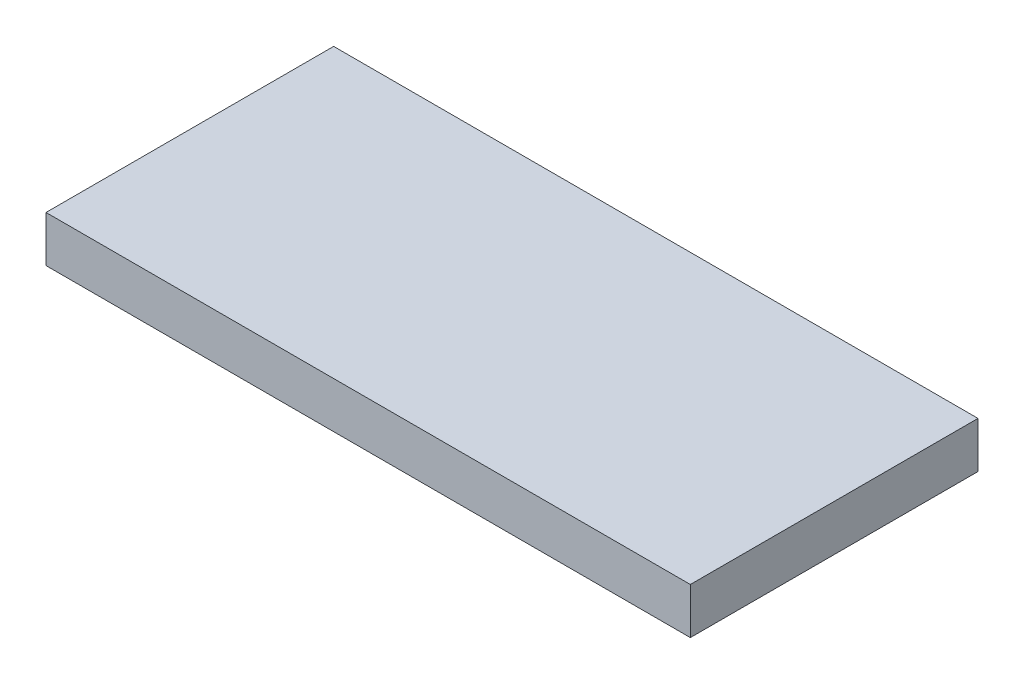
ISO-10303-21;
HEADER;
FILE_DESCRIPTION(('STEP AP214'),'2;1');
FILE_NAME('part.step','',(''),(''),'','','');
FILE_SCHEMA(('AUTOMOTIVE_DESIGN { 1 0 10303 214 1 1 1 1 }'));
ENDSEC;
DATA;
#1=APPLICATION_CONTEXT('core data for automotive mechanical design processes');
#2=APPLICATION_PROTOCOL_DEFINITION('international standard','automotive_design',2000,#1);
#3=PRODUCT_CONTEXT('',#1,'mechanical');
#4=PRODUCT('Part','Part','',(#3));
#5=PRODUCT_RELATED_PRODUCT_CATEGORY('part','',(#4));
#6=PRODUCT_DEFINITION_FORMATION('','',#4);
#7=PRODUCT_DEFINITION_CONTEXT('part definition',#1,'design');
#8=PRODUCT_DEFINITION('design','',#6,#7);
#9=PRODUCT_DEFINITION_SHAPE('','',#8);
#10=(LENGTH_UNIT() NAMED_UNIT(*) SI_UNIT(.MILLI.,.METRE.));
#11=(NAMED_UNIT(*) PLANE_ANGLE_UNIT() SI_UNIT($,.RADIAN.));
#12=(NAMED_UNIT(*) SI_UNIT($,.STERADIAN.) SOLID_ANGLE_UNIT());
#13=UNCERTAINTY_MEASURE_WITH_UNIT(LENGTH_MEASURE(1.E-05),#10,'distance_accuracy_value','');
#14=(GEOMETRIC_REPRESENTATION_CONTEXT(3) GLOBAL_UNCERTAINTY_ASSIGNED_CONTEXT((#13)) GLOBAL_UNIT_ASSIGNED_CONTEXT((#10,
#11,#12)) REPRESENTATION_CONTEXT('',''));
#15=CARTESIAN_POINT('',(0.,0.,0.));
#16=DIRECTION('',(0.,0.,1.));
#17=DIRECTION('',(1.,0.,0.));
#18=AXIS2_PLACEMENT_3D('',#15,#16,#17);
#19=CARTESIAN_POINT('',(0.,4.,25.));
#20=DIRECTION('',(1.,0.,0.));
#21=DIRECTION('',(0.,0.,-1.));
#22=AXIS2_PLACEMENT_3D('',#19,#20,#21);
#23=PLANE('',#22);
#24=DIRECTION('',(0.,-1.,0.));
#25=VECTOR('',#24,1.);
#26=CARTESIAN_POINT('',(0.,4.,0.));
#27=LINE('',#26,#25);
#28=CARTESIAN_POINT('',(0.,4.,0.));
#29=VERTEX_POINT('',#28);
#30=CARTESIAN_POINT('',(0.,0.,0.));
#31=VERTEX_POINT('',#30);
#32=EDGE_CURVE('E102',#29,#31,#27,.T.);
#33=ORIENTED_EDGE('',*,*,#32,.T.);
#34=DIRECTION('',(0.,0.,-1.));
#35=VECTOR('',#34,1.);
#36=CARTESIAN_POINT('',(0.,0.,25.));
#37=LINE('',#36,#35);
#38=CARTESIAN_POINT('',(0.,0.,25.));
#39=VERTEX_POINT('',#38);
#40=EDGE_CURVE('E11',#39,#31,#37,.T.);
#41=ORIENTED_EDGE('',*,*,#40,.F.);
#42=DIRECTION('',(0.,-1.,0.));
#43=VECTOR('',#42,1.);
#44=CARTESIAN_POINT('',(0.,4.,25.));
#45=LINE('',#44,#43);
#46=CARTESIAN_POINT('',(0.,4.,25.));
#47=VERTEX_POINT('',#46);
#48=EDGE_CURVE('E90',#47,#39,#45,.T.);
#49=ORIENTED_EDGE('',*,*,#48,.F.);
#50=DIRECTION('',(0.,0.,-1.));
#51=VECTOR('',#50,1.);
#52=CARTESIAN_POINT('',(0.,4.,25.));
#53=LINE('',#52,#51);
#54=EDGE_CURVE('E98',#47,#29,#53,.T.);
#55=ORIENTED_EDGE('',*,*,#54,.T.);
#56=EDGE_LOOP('',(#33,#41,#49,#55));
#57=FACE_BOUND('',#56,.T.);
#58=ADVANCED_FACE('F39',(#57),#23,.F.);
#59=CARTESIAN_POINT('',(0.,0.,25.));
#60=DIRECTION('',(0.,1.,0.));
#61=DIRECTION('',(0.,0.,1.));
#62=AXIS2_PLACEMENT_3D('',#59,#60,#61);
#63=PLANE('',#62);
#64=DIRECTION('',(1.,0.,0.));
#65=VECTOR('',#64,1.);
#66=CARTESIAN_POINT('',(0.,0.,0.));
#67=LINE('',#66,#65);
#68=CARTESIAN_POINT('',(56.,0.,0.));
#69=VERTEX_POINT('',#68);
#70=EDGE_CURVE('E94',#31,#69,#67,.T.);
#71=ORIENTED_EDGE('',*,*,#70,.T.);
#72=DIRECTION('',(0.,0.,-1.));
#73=VECTOR('',#72,1.);
#74=CARTESIAN_POINT('',(56.,0.,25.));
#75=LINE('',#74,#73);
#76=CARTESIAN_POINT('',(56.,0.,25.));
#77=VERTEX_POINT('',#76);
#78=EDGE_CURVE('E47',#77,#69,#75,.T.);
#79=ORIENTED_EDGE('',*,*,#78,.F.);
#80=DIRECTION('',(1.,0.,0.));
#81=VECTOR('',#80,1.);
#82=CARTESIAN_POINT('',(0.,0.,25.));
#83=LINE('',#82,#81);
#84=EDGE_CURVE('E85',#39,#77,#83,.T.);
#85=ORIENTED_EDGE('',*,*,#84,.F.);
#86=ORIENTED_EDGE('',*,*,#40,.T.);
#87=EDGE_LOOP('',(#71,#79,#85,#86));
#88=FACE_BOUND('',#87,.T.);
#89=ADVANCED_FACE('F93',(#88),#63,.F.);
#90=CARTESIAN_POINT('',(56.,0.,25.));
#91=DIRECTION('',(-1.,0.,0.));
#92=DIRECTION('',(0.,0.,1.));
#93=AXIS2_PLACEMENT_3D('',#90,#91,#92);
#94=PLANE('',#93);
#95=DIRECTION('',(0.,1.,0.));
#96=VECTOR('',#95,1.);
#97=CARTESIAN_POINT('',(56.,0.,0.));
#98=LINE('',#97,#96);
#99=CARTESIAN_POINT('',(56.,4.,0.));
#100=VERTEX_POINT('',#99);
#101=EDGE_CURVE('E72',#69,#100,#98,.T.);
#102=ORIENTED_EDGE('',*,*,#101,.T.);
#103=DIRECTION('',(0.,0.,-1.));
#104=VECTOR('',#103,1.);
#105=CARTESIAN_POINT('',(56.,4.,25.));
#106=LINE('',#105,#104);
#107=CARTESIAN_POINT('',(56.,4.,25.));
#108=VERTEX_POINT('',#107);
#109=EDGE_CURVE('E95',#108,#100,#106,.T.);
#110=ORIENTED_EDGE('',*,*,#109,.F.);
#111=DIRECTION('',(0.,1.,0.));
#112=VECTOR('',#111,1.);
#113=CARTESIAN_POINT('',(56.,0.,25.));
#114=LINE('',#113,#112);
#115=EDGE_CURVE('E88',#77,#108,#114,.T.);
#116=ORIENTED_EDGE('',*,*,#115,.F.);
#117=ORIENTED_EDGE('',*,*,#78,.T.);
#118=EDGE_LOOP('',(#102,#110,#116,#117));
#119=FACE_BOUND('',#118,.T.);
#120=ADVANCED_FACE('F96',(#119),#94,.F.);
#121=CARTESIAN_POINT('',(56.,4.,25.));
#122=DIRECTION('',(0.,-1.,0.));
#123=DIRECTION('',(0.,0.,-1.));
#124=AXIS2_PLACEMENT_3D('',#121,#122,#123);
#125=PLANE('',#124);
#126=DIRECTION('',(-1.,0.,0.));
#127=VECTOR('',#126,1.);
#128=CARTESIAN_POINT('',(56.,4.,0.));
#129=LINE('',#128,#127);
#130=EDGE_CURVE('E78',#100,#29,#129,.T.);
#131=ORIENTED_EDGE('',*,*,#130,.T.);
#132=ORIENTED_EDGE('',*,*,#54,.F.);
#133=DIRECTION('',(-1.,0.,0.));
#134=VECTOR('',#133,1.);
#135=CARTESIAN_POINT('',(56.,4.,25.));
#136=LINE('',#135,#134);
#137=EDGE_CURVE('E55',#108,#47,#136,.T.);
#138=ORIENTED_EDGE('',*,*,#137,.F.);
#139=ORIENTED_EDGE('',*,*,#109,.T.);
#140=EDGE_LOOP('',(#131,#132,#138,#139));
#141=FACE_BOUND('',#140,.T.);
#142=ADVANCED_FACE('F109',(#141),#125,.F.);
#143=CARTESIAN_POINT('',(0.,0.,25.));
#144=DIRECTION('',(0.,0.,1.));
#145=DIRECTION('',(1.,0.,0.));
#146=AXIS2_PLACEMENT_3D('',#143,#144,#145);
#147=PLANE('',#146);
#148=ORIENTED_EDGE('',*,*,#48,.T.);
#149=ORIENTED_EDGE('',*,*,#84,.T.);
#150=ORIENTED_EDGE('',*,*,#115,.T.);
#151=ORIENTED_EDGE('',*,*,#137,.T.);
#152=EDGE_LOOP('',(#148,#149,#150,#151));
#153=FACE_BOUND('',#152,.T.);
#154=ADVANCED_FACE('F86',(#153),#147,.T.);
#155=CARTESIAN_POINT('',(0.,0.,0.));
#156=DIRECTION('',(0.,0.,1.));
#157=DIRECTION('',(1.,0.,0.));
#158=AXIS2_PLACEMENT_3D('',#155,#156,#157);
#159=PLANE('',#158);
#160=ORIENTED_EDGE('',*,*,#32,.F.);
#161=ORIENTED_EDGE('',*,*,#130,.F.);
#162=ORIENTED_EDGE('',*,*,#101,.F.);
#163=ORIENTED_EDGE('',*,*,#70,.F.);
#164=EDGE_LOOP('',(#160,#161,#162,#163));
#165=FACE_BOUND('',#164,.T.);
#166=ADVANCED_FACE('F112',(#165),#159,.F.);
#167=CLOSED_SHELL('',(#58,#89,#120,#142,#154,#166));
#168=MANIFOLD_SOLID_BREP('B2',#167);
#169=ADVANCED_BREP_SHAPE_REPRESENTATION('',(#18,#168),#14);
#170=SHAPE_DEFINITION_REPRESENTATION(#9,#169);
ENDSEC;
END-ISO-10303-21;
